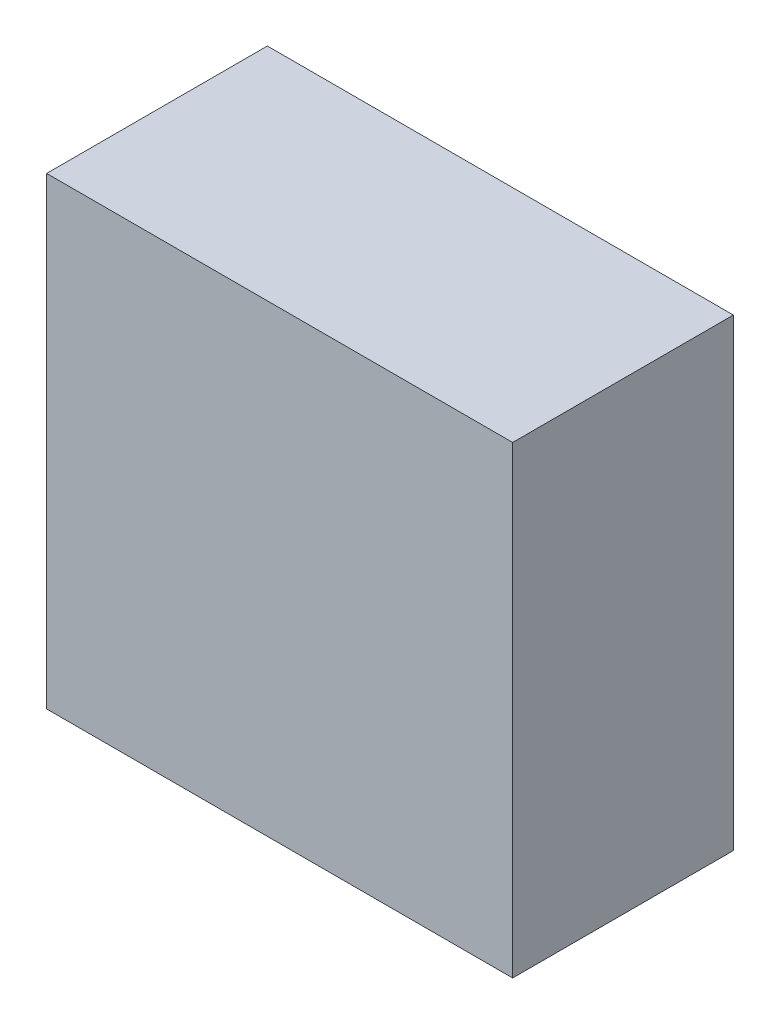
ISO-10303-21;
HEADER;
FILE_DESCRIPTION(('STEP AP214'),'2;1');
FILE_NAME('part.step','',(''),(''),'','','');
FILE_SCHEMA(('AUTOMOTIVE_DESIGN { 1 0 10303 214 1 1 1 1 }'));
ENDSEC;
DATA;
#1=APPLICATION_CONTEXT('core data for automotive mechanical design processes');
#2=APPLICATION_PROTOCOL_DEFINITION('international standard','automotive_design',2000,#1);
#3=PRODUCT_CONTEXT('',#1,'mechanical');
#4=PRODUCT('Part','Part','',(#3));
#5=PRODUCT_RELATED_PRODUCT_CATEGORY('part','',(#4));
#6=PRODUCT_DEFINITION_FORMATION('','',#4);
#7=PRODUCT_DEFINITION_CONTEXT('part definition',#1,'design');
#8=PRODUCT_DEFINITION('design','',#6,#7);
#9=PRODUCT_DEFINITION_SHAPE('','',#8);
#10=(LENGTH_UNIT() NAMED_UNIT(*) SI_UNIT(.MILLI.,.METRE.));
#11=(NAMED_UNIT(*) PLANE_ANGLE_UNIT() SI_UNIT($,.RADIAN.));
#12=(NAMED_UNIT(*) SI_UNIT($,.STERADIAN.) SOLID_ANGLE_UNIT());
#13=UNCERTAINTY_MEASURE_WITH_UNIT(LENGTH_MEASURE(1.E-05),#10,'distance_accuracy_value','');
#14=(GEOMETRIC_REPRESENTATION_CONTEXT(3) GLOBAL_UNCERTAINTY_ASSIGNED_CONTEXT((#13)) GLOBAL_UNIT_ASSIGNED_CONTEXT((#10,
#11,#12)) REPRESENTATION_CONTEXT('',''));
#15=CARTESIAN_POINT('',(0.,0.,0.));
#16=DIRECTION('',(0.,0.,1.));
#17=DIRECTION('',(1.,0.,0.));
#18=AXIS2_PLACEMENT_3D('',#15,#16,#17);
#19=CARTESIAN_POINT('',(-1.10655,-1.1016,1.));
#20=DIRECTION('',(1.,0.,0.));
#21=DIRECTION('',(0.,0.,-1.));
#22=AXIS2_PLACEMENT_3D('',#19,#20,#21);
#23=PLANE('',#22);
#24=DIRECTION('',(0.,-1.,0.));
#25=VECTOR('',#24,1.);
#26=CARTESIAN_POINT('',(-1.10655,-1.1016,0.));
#27=LINE('',#26,#25);
#28=CARTESIAN_POINT('',(-1.10655,1.,0.));
#29=VERTEX_POINT('',#28);
#30=CARTESIAN_POINT('',(-1.10655,-1.1016,0.));
#31=VERTEX_POINT('',#30);
#32=EDGE_CURVE('E95',#29,#31,#27,.T.);
#33=ORIENTED_EDGE('',*,*,#32,.T.);
#34=DIRECTION('',(0.,0.,-1.));
#35=VECTOR('',#34,1.);
#36=CARTESIAN_POINT('',(-1.10655,-1.1016,1.));
#37=LINE('',#36,#35);
#38=CARTESIAN_POINT('',(-1.10655,-1.1016,1.));
#39=VERTEX_POINT('',#38);
#40=EDGE_CURVE('E11',#39,#31,#37,.T.);
#41=ORIENTED_EDGE('',*,*,#40,.F.);
#42=DIRECTION('',(0.,-1.,0.));
#43=VECTOR('',#42,1.);
#44=CARTESIAN_POINT('',(-1.10655,-1.1016,1.));
#45=LINE('',#44,#43);
#46=CARTESIAN_POINT('',(-1.10655,1.,1.));
#47=VERTEX_POINT('',#46);
#48=EDGE_CURVE('E83',#47,#39,#45,.T.);
#49=ORIENTED_EDGE('',*,*,#48,.F.);
#50=DIRECTION('',(0.,0.,-1.));
#51=VECTOR('',#50,1.);
#52=CARTESIAN_POINT('',(-1.10655,1.,1.));
#53=LINE('',#52,#51);
#54=EDGE_CURVE('E91',#47,#29,#53,.T.);
#55=ORIENTED_EDGE('',*,*,#54,.T.);
#56=EDGE_LOOP('',(#33,#41,#49,#55));
#57=FACE_BOUND('',#56,.T.);
#58=ADVANCED_FACE('F32',(#57),#23,.F.);
#59=CARTESIAN_POINT('',(1.00495,-1.1016,1.));
#60=DIRECTION('',(0.,1.,0.));
#61=DIRECTION('',(0.,0.,1.));
#62=AXIS2_PLACEMENT_3D('',#59,#60,#61);
#63=PLANE('',#62);
#64=DIRECTION('',(1.,0.,0.));
#65=VECTOR('',#64,1.);
#66=CARTESIAN_POINT('',(1.00495,-1.1016,0.));
#67=LINE('',#66,#65);
#68=CARTESIAN_POINT('',(1.00495,-1.1016,0.));
#69=VERTEX_POINT('',#68);
#70=EDGE_CURVE('E87',#31,#69,#67,.T.);
#71=ORIENTED_EDGE('',*,*,#70,.T.);
#72=DIRECTION('',(0.,0.,-1.));
#73=VECTOR('',#72,1.);
#74=CARTESIAN_POINT('',(1.00495,-1.1016,1.));
#75=LINE('',#74,#73);
#76=CARTESIAN_POINT('',(1.00495,-1.1016,1.));
#77=VERTEX_POINT('',#76);
#78=EDGE_CURVE('E40',#77,#69,#75,.T.);
#79=ORIENTED_EDGE('',*,*,#78,.F.);
#80=DIRECTION('',(1.,0.,0.));
#81=VECTOR('',#80,1.);
#82=CARTESIAN_POINT('',(1.00495,-1.1016,1.));
#83=LINE('',#82,#81);
#84=EDGE_CURVE('E78',#39,#77,#83,.T.);
#85=ORIENTED_EDGE('',*,*,#84,.F.);
#86=ORIENTED_EDGE('',*,*,#40,.T.);
#87=EDGE_LOOP('',(#71,#79,#85,#86));
#88=FACE_BOUND('',#87,.T.);
#89=ADVANCED_FACE('F86',(#88),#63,.F.);
#90=CARTESIAN_POINT('',(1.00495,1.,1.));
#91=DIRECTION('',(-1.,0.,0.));
#92=DIRECTION('',(0.,0.,1.));
#93=AXIS2_PLACEMENT_3D('',#90,#91,#92);
#94=PLANE('',#93);
#95=DIRECTION('',(0.,1.,0.));
#96=VECTOR('',#95,1.);
#97=CARTESIAN_POINT('',(1.00495,1.,0.));
#98=LINE('',#97,#96);
#99=CARTESIAN_POINT('',(1.00495,1.,0.));
#100=VERTEX_POINT('',#99);
#101=EDGE_CURVE('E65',#69,#100,#98,.T.);
#102=ORIENTED_EDGE('',*,*,#101,.T.);
#103=DIRECTION('',(0.,0.,-1.));
#104=VECTOR('',#103,1.);
#105=CARTESIAN_POINT('',(1.00495,1.,1.));
#106=LINE('',#105,#104);
#107=CARTESIAN_POINT('',(1.00495,1.,1.));
#108=VERTEX_POINT('',#107);
#109=EDGE_CURVE('E88',#108,#100,#106,.T.);
#110=ORIENTED_EDGE('',*,*,#109,.F.);
#111=DIRECTION('',(0.,1.,0.));
#112=VECTOR('',#111,1.);
#113=CARTESIAN_POINT('',(1.00495,1.,1.));
#114=LINE('',#113,#112);
#115=EDGE_CURVE('E81',#77,#108,#114,.T.);
#116=ORIENTED_EDGE('',*,*,#115,.F.);
#117=ORIENTED_EDGE('',*,*,#78,.T.);
#118=EDGE_LOOP('',(#102,#110,#116,#117));
#119=FACE_BOUND('',#118,.T.);
#120=ADVANCED_FACE('F89',(#119),#94,.F.);
#121=CARTESIAN_POINT('',(-1.10655,1.,1.));
#122=DIRECTION('',(0.,-1.,0.));
#123=DIRECTION('',(0.,0.,-1.));
#124=AXIS2_PLACEMENT_3D('',#121,#122,#123);
#125=PLANE('',#124);
#126=DIRECTION('',(-1.,0.,0.));
#127=VECTOR('',#126,1.);
#128=CARTESIAN_POINT('',(-1.10655,1.,0.));
#129=LINE('',#128,#127);
#130=EDGE_CURVE('E71',#100,#29,#129,.T.);
#131=ORIENTED_EDGE('',*,*,#130,.T.);
#132=ORIENTED_EDGE('',*,*,#54,.F.);
#133=DIRECTION('',(-1.,0.,0.));
#134=VECTOR('',#133,1.);
#135=CARTESIAN_POINT('',(-1.10655,1.,1.));
#136=LINE('',#135,#134);
#137=EDGE_CURVE('E48',#108,#47,#136,.T.);
#138=ORIENTED_EDGE('',*,*,#137,.F.);
#139=ORIENTED_EDGE('',*,*,#109,.T.);
#140=EDGE_LOOP('',(#131,#132,#138,#139));
#141=FACE_BOUND('',#140,.T.);
#142=ADVANCED_FACE('F102',(#141),#125,.F.);
#143=CARTESIAN_POINT('',(0.,0.,1.));
#144=DIRECTION('',(0.,0.,-1.));
#145=DIRECTION('',(-1.,0.,0.));
#146=AXIS2_PLACEMENT_3D('',#143,#144,#145);
#147=PLANE('',#146);
#148=ORIENTED_EDGE('',*,*,#48,.T.);
#149=ORIENTED_EDGE('',*,*,#84,.T.);
#150=ORIENTED_EDGE('',*,*,#115,.T.);
#151=ORIENTED_EDGE('',*,*,#137,.T.);
#152=EDGE_LOOP('',(#148,#149,#150,#151));
#153=FACE_BOUND('',#152,.T.);
#154=ADVANCED_FACE('F79',(#153),#147,.F.);
#155=CARTESIAN_POINT('',(0.,0.,0.));
#156=DIRECTION('',(0.,0.,-1.));
#157=DIRECTION('',(-1.,0.,0.));
#158=AXIS2_PLACEMENT_3D('',#155,#156,#157);
#159=PLANE('',#158);
#160=ORIENTED_EDGE('',*,*,#32,.F.);
#161=ORIENTED_EDGE('',*,*,#130,.F.);
#162=ORIENTED_EDGE('',*,*,#101,.F.);
#163=ORIENTED_EDGE('',*,*,#70,.F.);
#164=EDGE_LOOP('',(#160,#161,#162,#163));
#165=FACE_BOUND('',#164,.T.);
#166=ADVANCED_FACE('F105',(#165),#159,.T.);
#167=CLOSED_SHELL('',(#58,#89,#120,#142,#154,#166));
#168=MANIFOLD_SOLID_BREP('B2',#167);
#169=ADVANCED_BREP_SHAPE_REPRESENTATION('',(#18,#168),#14);
#170=SHAPE_DEFINITION_REPRESENTATION(#9,#169);
ENDSEC;
END-ISO-10303-21;
